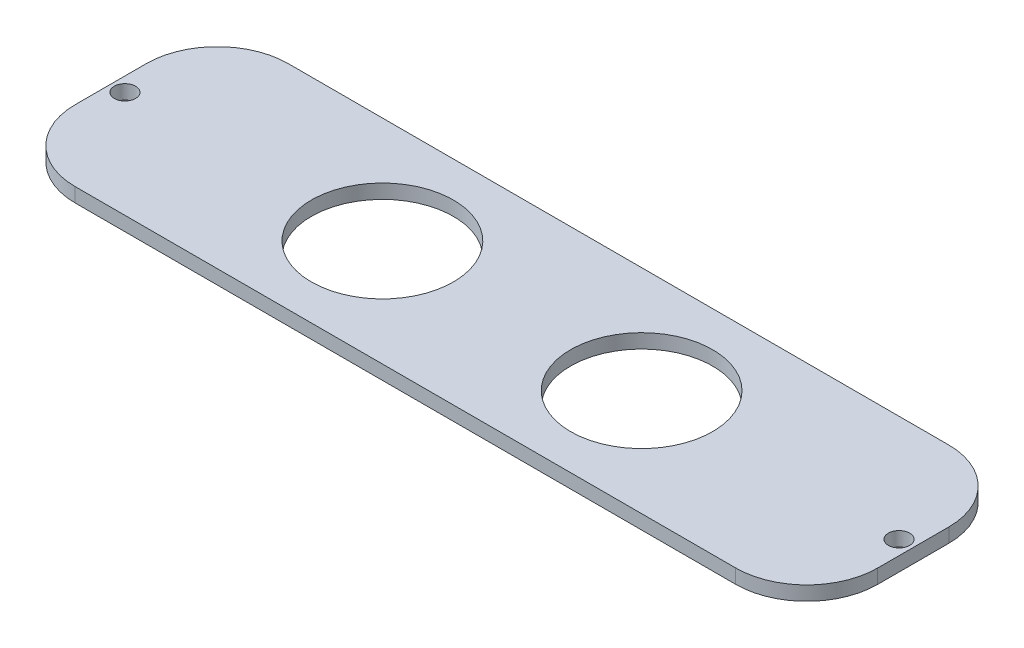
ISO-10303-21;
HEADER;
FILE_DESCRIPTION(('STEP AP214'),'2;1');
FILE_NAME('part.step','',(''),(''),'','','');
FILE_SCHEMA(('AUTOMOTIVE_DESIGN { 1 0 10303 214 1 1 1 1 }'));
ENDSEC;
DATA;
#1=APPLICATION_CONTEXT('core data for automotive mechanical design processes');
#2=APPLICATION_PROTOCOL_DEFINITION('international standard','automotive_design',2000,#1);
#3=PRODUCT_CONTEXT('',#1,'mechanical');
#4=PRODUCT('Part','Part','',(#3));
#5=PRODUCT_RELATED_PRODUCT_CATEGORY('part','',(#4));
#6=PRODUCT_DEFINITION_FORMATION('','',#4);
#7=PRODUCT_DEFINITION_CONTEXT('part definition',#1,'design');
#8=PRODUCT_DEFINITION('design','',#6,#7);
#9=PRODUCT_DEFINITION_SHAPE('','',#8);
#10=(LENGTH_UNIT() NAMED_UNIT(*) SI_UNIT(.MILLI.,.METRE.));
#11=(NAMED_UNIT(*) PLANE_ANGLE_UNIT() SI_UNIT($,.RADIAN.));
#12=(NAMED_UNIT(*) SI_UNIT($,.STERADIAN.) SOLID_ANGLE_UNIT());
#13=UNCERTAINTY_MEASURE_WITH_UNIT(LENGTH_MEASURE(1.E-05),#10,'distance_accuracy_value','');
#14=(GEOMETRIC_REPRESENTATION_CONTEXT(3) GLOBAL_UNCERTAINTY_ASSIGNED_CONTEXT((#13)) GLOBAL_UNIT_ASSIGNED_CONTEXT((#10,
#11,#12)) REPRESENTATION_CONTEXT('',''));
#15=CARTESIAN_POINT('',(0.,0.,0.));
#16=DIRECTION('',(0.,0.,1.));
#17=DIRECTION('',(1.,0.,0.));
#18=AXIS2_PLACEMENT_3D('',#15,#16,#17);
#19=CARTESIAN_POINT('',(-46.5,2.,5.));
#20=DIRECTION('',(0.,-1.,0.));
#21=DIRECTION('',(0.,0.,-1.));
#22=AXIS2_PLACEMENT_3D('',#19,#20,#21);
#23=PLANE('',#22);
#24=CARTESIAN_POINT('',(-46.5,2.,5.));
#25=DIRECTION('',(0.,1.,0.));
#26=DIRECTION('',(0.,0.,-1.));
#27=AXIS2_PLACEMENT_3D('',#24,#25,#26);
#28=CIRCLE('',#27,10.);
#29=CARTESIAN_POINT('',(-56.5,2.,4.99999999999993));
#30=VERTEX_POINT('',#29);
#31=CARTESIAN_POINT('',(-46.4999999999999,2.,15.));
#32=VERTEX_POINT('',#31);
#33=EDGE_CURVE('E148',#30,#32,#28,.T.);
#34=ORIENTED_EDGE('',*,*,#33,.T.);
#35=DIRECTION('',(1.,0.,0.));
#36=VECTOR('',#35,1.);
#37=CARTESIAN_POINT('',(-46.4999999999999,2.,15.));
#38=LINE('',#37,#36);
#39=CARTESIAN_POINT('',(46.4999999999999,2.,15.));
#40=VERTEX_POINT('',#39);
#41=EDGE_CURVE('E96',#32,#40,#38,.T.);
#42=ORIENTED_EDGE('',*,*,#41,.T.);
#43=CARTESIAN_POINT('',(46.5,2.,5.));
#44=DIRECTION('',(0.,1.,0.));
#45=DIRECTION('',(0.,0.,1.));
#46=AXIS2_PLACEMENT_3D('',#43,#44,#45);
#47=CIRCLE('',#46,10.);
#48=CARTESIAN_POINT('',(56.5,2.,4.99999999999993));
#49=VERTEX_POINT('',#48);
#50=EDGE_CURVE('E163',#40,#49,#47,.T.);
#51=ORIENTED_EDGE('',*,*,#50,.T.);
#52=DIRECTION('',(0.,0.,-1.));
#53=VECTOR('',#52,1.);
#54=CARTESIAN_POINT('',(56.5,2.,4.99999999999993));
#55=LINE('',#54,#53);
#56=CARTESIAN_POINT('',(56.5,2.,-4.99999999999993));
#57=VERTEX_POINT('',#56);
#58=EDGE_CURVE('E176',#49,#57,#55,.T.);
#59=ORIENTED_EDGE('',*,*,#58,.T.);
#60=CARTESIAN_POINT('',(46.5,2.,-5.));
#61=DIRECTION('',(0.,1.,0.));
#62=DIRECTION('',(0.,0.,-1.));
#63=AXIS2_PLACEMENT_3D('',#60,#61,#62);
#64=CIRCLE('',#63,10.);
#65=CARTESIAN_POINT('',(46.4999999999999,2.,-15.));
#66=VERTEX_POINT('',#65);
#67=EDGE_CURVE('E115',#57,#66,#64,.T.);
#68=ORIENTED_EDGE('',*,*,#67,.T.);
#69=DIRECTION('',(-1.,0.,0.));
#70=VECTOR('',#69,1.);
#71=CARTESIAN_POINT('',(-46.4999999999999,2.,-15.));
#72=LINE('',#71,#70);
#73=CARTESIAN_POINT('',(-46.4999999999999,2.,-15.));
#74=VERTEX_POINT('',#73);
#75=EDGE_CURVE('E109',#66,#74,#72,.T.);
#76=ORIENTED_EDGE('',*,*,#75,.T.);
#77=CARTESIAN_POINT('',(-46.5,2.,-5.));
#78=DIRECTION('',(0.,1.,0.));
#79=DIRECTION('',(0.,0.,-1.));
#80=AXIS2_PLACEMENT_3D('',#77,#78,#79);
#81=CIRCLE('',#80,10.);
#82=CARTESIAN_POINT('',(-56.5,2.,-4.99999999999993));
#83=VERTEX_POINT('',#82);
#84=EDGE_CURVE('E113',#74,#83,#81,.T.);
#85=ORIENTED_EDGE('',*,*,#84,.T.);
#86=DIRECTION('',(0.,0.,1.));
#87=VECTOR('',#86,1.);
#88=CARTESIAN_POINT('',(-56.5,2.,4.99999999999993));
#89=LINE('',#88,#87);
#90=EDGE_CURVE('E53',#83,#30,#89,.T.);
#91=ORIENTED_EDGE('',*,*,#90,.T.);
#92=EDGE_LOOP('',(#34,#42,#51,#59,#68,#76,#85,#91));
#93=FACE_BOUND('',#92,.T.);
#94=CARTESIAN_POINT('',(18.25,2.,0.));
#95=DIRECTION('',(0.,1.,0.));
#96=DIRECTION('',(0.,0.,1.));
#97=AXIS2_PLACEMENT_3D('',#94,#95,#96);
#98=CIRCLE('',#97,10.);
#99=CARTESIAN_POINT('',(18.25,2.,9.99999999999999));
#100=VERTEX_POINT('',#99);
#101=EDGE_CURVE('E137',#100,#100,#98,.T.);
#102=ORIENTED_EDGE('',*,*,#101,.F.);
#103=EDGE_LOOP('',(#102));
#104=FACE_BOUND('',#103,.T.);
#105=CARTESIAN_POINT('',(-18.25,2.,0.));
#106=DIRECTION('',(0.,1.,0.));
#107=DIRECTION('',(0.,0.,1.));
#108=AXIS2_PLACEMENT_3D('',#105,#106,#107);
#109=CIRCLE('',#108,10.);
#110=CARTESIAN_POINT('',(-18.25,2.,10.));
#111=VERTEX_POINT('',#110);
#112=EDGE_CURVE('E185',#111,#111,#109,.T.);
#113=ORIENTED_EDGE('',*,*,#112,.F.);
#114=EDGE_LOOP('',(#113));
#115=FACE_BOUND('',#114,.T.);
#116=CARTESIAN_POINT('',(54.5,2.,0.));
#117=DIRECTION('',(0.,1.,0.));
#118=DIRECTION('',(0.,0.,1.));
#119=AXIS2_PLACEMENT_3D('',#116,#117,#118);
#120=CIRCLE('',#119,1.5);
#121=CARTESIAN_POINT('',(54.5,2.,1.5));
#122=VERTEX_POINT('',#121);
#123=EDGE_CURVE('E191',#122,#122,#120,.T.);
#124=ORIENTED_EDGE('',*,*,#123,.F.);
#125=EDGE_LOOP('',(#124));
#126=FACE_BOUND('',#125,.T.);
#127=CARTESIAN_POINT('',(-54.5,2.,0.));
#128=DIRECTION('',(0.,1.,0.));
#129=DIRECTION('',(0.,0.,1.));
#130=AXIS2_PLACEMENT_3D('',#127,#128,#129);
#131=CIRCLE('',#130,1.5);
#132=CARTESIAN_POINT('',(-54.5,2.,1.5));
#133=VERTEX_POINT('',#132);
#134=EDGE_CURVE('E197',#133,#133,#131,.T.);
#135=ORIENTED_EDGE('',*,*,#134,.F.);
#136=EDGE_LOOP('',(#135));
#137=FACE_BOUND('',#136,.T.);
#138=ADVANCED_FACE('F36',(#93,#104,#115,#126,#137),#23,.F.);
#139=CARTESIAN_POINT('',(-46.5,0.,5.));
#140=DIRECTION('',(0.,-1.,0.));
#141=DIRECTION('',(0.,0.,-1.));
#142=AXIS2_PLACEMENT_3D('',#139,#140,#141);
#143=PLANE('',#142);
#144=CARTESIAN_POINT('',(54.5,0.,0.));
#145=DIRECTION('',(0.,1.,0.));
#146=DIRECTION('',(0.,0.,1.));
#147=AXIS2_PLACEMENT_3D('',#144,#145,#146);
#148=CIRCLE('',#147,1.5);
#149=CARTESIAN_POINT('',(54.5,0.,1.5));
#150=VERTEX_POINT('',#149);
#151=EDGE_CURVE('E194',#150,#150,#148,.T.);
#152=ORIENTED_EDGE('',*,*,#151,.T.);
#153=EDGE_LOOP('',(#152));
#154=FACE_BOUND('',#153,.T.);
#155=CARTESIAN_POINT('',(18.25,0.,0.));
#156=DIRECTION('',(0.,1.,0.));
#157=DIRECTION('',(0.,0.,1.));
#158=AXIS2_PLACEMENT_3D('',#155,#156,#157);
#159=CIRCLE('',#158,10.);
#160=CARTESIAN_POINT('',(18.25,0.,9.99999999999999));
#161=VERTEX_POINT('',#160);
#162=EDGE_CURVE('E182',#161,#161,#159,.T.);
#163=ORIENTED_EDGE('',*,*,#162,.T.);
#164=EDGE_LOOP('',(#163));
#165=FACE_BOUND('',#164,.T.);
#166=CARTESIAN_POINT('',(-46.5,0.,5.));
#167=DIRECTION('',(0.,1.,0.));
#168=DIRECTION('',(0.,0.,-1.));
#169=AXIS2_PLACEMENT_3D('',#166,#167,#168);
#170=CIRCLE('',#169,10.);
#171=CARTESIAN_POINT('',(-56.5,0.,4.99999999999993));
#172=VERTEX_POINT('',#171);
#173=CARTESIAN_POINT('',(-46.4999999999999,0.,15.));
#174=VERTEX_POINT('',#173);
#175=EDGE_CURVE('E133',#172,#174,#170,.T.);
#176=ORIENTED_EDGE('',*,*,#175,.F.);
#177=DIRECTION('',(0.,0.,1.));
#178=VECTOR('',#177,1.);
#179=CARTESIAN_POINT('',(-56.5,0.,4.99999999999993));
#180=LINE('',#179,#178);
#181=CARTESIAN_POINT('',(-56.5,0.,-4.99999999999993));
#182=VERTEX_POINT('',#181);
#183=EDGE_CURVE('E88',#182,#172,#180,.T.);
#184=ORIENTED_EDGE('',*,*,#183,.F.);
#185=CARTESIAN_POINT('',(-46.5,0.,-5.));
#186=DIRECTION('',(0.,1.,0.));
#187=DIRECTION('',(0.,0.,-1.));
#188=AXIS2_PLACEMENT_3D('',#185,#186,#187);
#189=CIRCLE('',#188,10.);
#190=CARTESIAN_POINT('',(-46.4999999999999,0.,-15.));
#191=VERTEX_POINT('',#190);
#192=EDGE_CURVE('E82',#191,#182,#189,.T.);
#193=ORIENTED_EDGE('',*,*,#192,.F.);
#194=DIRECTION('',(-1.,0.,0.));
#195=VECTOR('',#194,1.);
#196=CARTESIAN_POINT('',(-46.4999999999999,0.,-15.));
#197=LINE('',#196,#195);
#198=CARTESIAN_POINT('',(46.4999999999999,0.,-15.));
#199=VERTEX_POINT('',#198);
#200=EDGE_CURVE('E123',#199,#191,#197,.T.);
#201=ORIENTED_EDGE('',*,*,#200,.F.);
#202=CARTESIAN_POINT('',(46.5,0.,-5.));
#203=DIRECTION('',(0.,1.,0.));
#204=DIRECTION('',(0.,0.,-1.));
#205=AXIS2_PLACEMENT_3D('',#202,#203,#204);
#206=CIRCLE('',#205,10.);
#207=CARTESIAN_POINT('',(56.5,0.,-4.99999999999993));
#208=VERTEX_POINT('',#207);
#209=EDGE_CURVE('E143',#208,#199,#206,.T.);
#210=ORIENTED_EDGE('',*,*,#209,.F.);
#211=DIRECTION('',(0.,0.,-1.));
#212=VECTOR('',#211,1.);
#213=CARTESIAN_POINT('',(56.5,0.,4.99999999999993));
#214=LINE('',#213,#212);
#215=CARTESIAN_POINT('',(56.5,0.,4.99999999999993));
#216=VERTEX_POINT('',#215);
#217=EDGE_CURVE('E141',#216,#208,#214,.T.);
#218=ORIENTED_EDGE('',*,*,#217,.F.);
#219=CARTESIAN_POINT('',(46.5,0.,5.));
#220=DIRECTION('',(0.,1.,0.));
#221=DIRECTION('',(0.,0.,1.));
#222=AXIS2_PLACEMENT_3D('',#219,#220,#221);
#223=CIRCLE('',#222,10.);
#224=CARTESIAN_POINT('',(46.4999999999999,0.,15.));
#225=VERTEX_POINT('',#224);
#226=EDGE_CURVE('E139',#225,#216,#223,.T.);
#227=ORIENTED_EDGE('',*,*,#226,.F.);
#228=DIRECTION('',(1.,0.,0.));
#229=VECTOR('',#228,1.);
#230=CARTESIAN_POINT('',(-46.4999999999999,0.,15.));
#231=LINE('',#230,#229);
#232=EDGE_CURVE('E136',#174,#225,#231,.T.);
#233=ORIENTED_EDGE('',*,*,#232,.F.);
#234=EDGE_LOOP('',(#176,#184,#193,#201,#210,#218,#227,#233));
#235=FACE_BOUND('',#234,.T.);
#236=CARTESIAN_POINT('',(-18.25,0.,0.));
#237=DIRECTION('',(0.,1.,0.));
#238=DIRECTION('',(0.,0.,1.));
#239=AXIS2_PLACEMENT_3D('',#236,#237,#238);
#240=CIRCLE('',#239,10.);
#241=CARTESIAN_POINT('',(-18.25,0.,10.));
#242=VERTEX_POINT('',#241);
#243=EDGE_CURVE('E188',#242,#242,#240,.T.);
#244=ORIENTED_EDGE('',*,*,#243,.T.);
#245=EDGE_LOOP('',(#244));
#246=FACE_BOUND('',#245,.T.);
#247=CARTESIAN_POINT('',(-54.5,0.,0.));
#248=DIRECTION('',(0.,1.,0.));
#249=DIRECTION('',(0.,0.,1.));
#250=AXIS2_PLACEMENT_3D('',#247,#248,#249);
#251=CIRCLE('',#250,1.5);
#252=CARTESIAN_POINT('',(-54.5,0.,1.5));
#253=VERTEX_POINT('',#252);
#254=EDGE_CURVE('E200',#253,#253,#251,.T.);
#255=ORIENTED_EDGE('',*,*,#254,.T.);
#256=EDGE_LOOP('',(#255));
#257=FACE_BOUND('',#256,.T.);
#258=ADVANCED_FACE('F167',(#154,#165,#235,#246,#257),#143,.T.);
#259=CARTESIAN_POINT('',(-46.5,2.,5.));
#260=DIRECTION('',(0.,-1.,0.));
#261=DIRECTION('',(0.,0.,-1.));
#262=AXIS2_PLACEMENT_3D('',#259,#260,#261);
#263=CYLINDRICAL_SURFACE('',#262,10.);
#264=ORIENTED_EDGE('',*,*,#175,.T.);
#265=DIRECTION('',(0.,-1.,0.));
#266=VECTOR('',#265,1.);
#267=CARTESIAN_POINT('',(-46.4999999999999,2.,15.));
#268=LINE('',#267,#266);
#269=EDGE_CURVE('E11',#32,#174,#268,.T.);
#270=ORIENTED_EDGE('',*,*,#269,.F.);
#271=ORIENTED_EDGE('',*,*,#33,.F.);
#272=DIRECTION('',(0.,-1.,0.));
#273=VECTOR('',#272,1.);
#274=CARTESIAN_POINT('',(-56.5,2.,4.99999999999993));
#275=LINE('',#274,#273);
#276=EDGE_CURVE('E129',#30,#172,#275,.T.);
#277=ORIENTED_EDGE('',*,*,#276,.T.);
#278=EDGE_LOOP('',(#264,#270,#271,#277));
#279=FACE_BOUND('',#278,.T.);
#280=ADVANCED_FACE('F38',(#279),#263,.T.);
#281=CARTESIAN_POINT('',(-46.4999999999999,2.,15.));
#282=DIRECTION('',(0.,0.,-1.));
#283=DIRECTION('',(-1.,0.,0.));
#284=AXIS2_PLACEMENT_3D('',#281,#282,#283);
#285=PLANE('',#284);
#286=ORIENTED_EDGE('',*,*,#232,.T.);
#287=DIRECTION('',(0.,-1.,0.));
#288=VECTOR('',#287,1.);
#289=CARTESIAN_POINT('',(46.4999999999999,2.,15.));
#290=LINE('',#289,#288);
#291=EDGE_CURVE('E45',#40,#225,#290,.T.);
#292=ORIENTED_EDGE('',*,*,#291,.F.);
#293=ORIENTED_EDGE('',*,*,#41,.F.);
#294=ORIENTED_EDGE('',*,*,#269,.T.);
#295=EDGE_LOOP('',(#286,#292,#293,#294));
#296=FACE_BOUND('',#295,.T.);
#297=ADVANCED_FACE('F232',(#296),#285,.F.);
#298=CARTESIAN_POINT('',(46.5,2.,5.));
#299=DIRECTION('',(0.,-1.,0.));
#300=DIRECTION('',(0.,0.,-1.));
#301=AXIS2_PLACEMENT_3D('',#298,#299,#300);
#302=CYLINDRICAL_SURFACE('',#301,10.);
#303=ORIENTED_EDGE('',*,*,#226,.T.);
#304=DIRECTION('',(0.,-1.,0.));
#305=VECTOR('',#304,1.);
#306=CARTESIAN_POINT('',(56.5,2.,4.99999999999993));
#307=LINE('',#306,#305);
#308=EDGE_CURVE('E155',#49,#216,#307,.T.);
#309=ORIENTED_EDGE('',*,*,#308,.F.);
#310=ORIENTED_EDGE('',*,*,#50,.F.);
#311=ORIENTED_EDGE('',*,*,#291,.T.);
#312=EDGE_LOOP('',(#303,#309,#310,#311));
#313=FACE_BOUND('',#312,.T.);
#314=ADVANCED_FACE('F161',(#313),#302,.T.);
#315=CARTESIAN_POINT('',(56.5,2.,4.99999999999993));
#316=DIRECTION('',(-1.,0.,0.));
#317=DIRECTION('',(0.,0.,1.));
#318=AXIS2_PLACEMENT_3D('',#315,#316,#317);
#319=PLANE('',#318);
#320=ORIENTED_EDGE('',*,*,#217,.T.);
#321=DIRECTION('',(0.,-1.,0.));
#322=VECTOR('',#321,1.);
#323=CARTESIAN_POINT('',(56.5,2.,-4.99999999999993));
#324=LINE('',#323,#322);
#325=EDGE_CURVE('E152',#57,#208,#324,.T.);
#326=ORIENTED_EDGE('',*,*,#325,.F.);
#327=ORIENTED_EDGE('',*,*,#58,.F.);
#328=ORIENTED_EDGE('',*,*,#308,.T.);
#329=EDGE_LOOP('',(#320,#326,#327,#328));
#330=FACE_BOUND('',#329,.T.);
#331=ADVANCED_FACE('F172',(#330),#319,.F.);
#332=CARTESIAN_POINT('',(46.5,2.,-5.));
#333=DIRECTION('',(0.,-1.,0.));
#334=DIRECTION('',(0.,0.,-1.));
#335=AXIS2_PLACEMENT_3D('',#332,#333,#334);
#336=CYLINDRICAL_SURFACE('',#335,10.);
#337=ORIENTED_EDGE('',*,*,#209,.T.);
#338=DIRECTION('',(0.,-1.,0.));
#339=VECTOR('',#338,1.);
#340=CARTESIAN_POINT('',(46.4999999999999,2.,-15.));
#341=LINE('',#340,#339);
#342=EDGE_CURVE('E124',#66,#199,#341,.T.);
#343=ORIENTED_EDGE('',*,*,#342,.F.);
#344=ORIENTED_EDGE('',*,*,#67,.F.);
#345=ORIENTED_EDGE('',*,*,#325,.T.);
#346=EDGE_LOOP('',(#337,#343,#344,#345));
#347=FACE_BOUND('',#346,.T.);
#348=ADVANCED_FACE('F175',(#347),#336,.T.);
#349=CARTESIAN_POINT('',(-46.4999999999999,2.,-15.));
#350=DIRECTION('',(0.,0.,1.));
#351=DIRECTION('',(1.,0.,0.));
#352=AXIS2_PLACEMENT_3D('',#349,#350,#351);
#353=PLANE('',#352);
#354=ORIENTED_EDGE('',*,*,#200,.T.);
#355=DIRECTION('',(0.,-1.,0.));
#356=VECTOR('',#355,1.);
#357=CARTESIAN_POINT('',(-46.4999999999999,2.,-15.));
#358=LINE('',#357,#356);
#359=EDGE_CURVE('E120',#74,#191,#358,.T.);
#360=ORIENTED_EDGE('',*,*,#359,.F.);
#361=ORIENTED_EDGE('',*,*,#75,.F.);
#362=ORIENTED_EDGE('',*,*,#342,.T.);
#363=EDGE_LOOP('',(#354,#360,#361,#362));
#364=FACE_BOUND('',#363,.T.);
#365=ADVANCED_FACE('F121',(#364),#353,.F.);
#366=CARTESIAN_POINT('',(-46.5,2.,-5.));
#367=DIRECTION('',(0.,-1.,0.));
#368=DIRECTION('',(0.,0.,-1.));
#369=AXIS2_PLACEMENT_3D('',#366,#367,#368);
#370=CYLINDRICAL_SURFACE('',#369,10.);
#371=ORIENTED_EDGE('',*,*,#192,.T.);
#372=DIRECTION('',(0.,-1.,0.));
#373=VECTOR('',#372,1.);
#374=CARTESIAN_POINT('',(-56.5,2.,-4.99999999999993));
#375=LINE('',#374,#373);
#376=EDGE_CURVE('E125',#83,#182,#375,.T.);
#377=ORIENTED_EDGE('',*,*,#376,.F.);
#378=ORIENTED_EDGE('',*,*,#84,.F.);
#379=ORIENTED_EDGE('',*,*,#359,.T.);
#380=EDGE_LOOP('',(#371,#377,#378,#379));
#381=FACE_BOUND('',#380,.T.);
#382=ADVANCED_FACE('F127',(#381),#370,.T.);
#383=CARTESIAN_POINT('',(-56.5,2.,4.99999999999993));
#384=DIRECTION('',(1.,0.,0.));
#385=DIRECTION('',(0.,0.,-1.));
#386=AXIS2_PLACEMENT_3D('',#383,#384,#385);
#387=PLANE('',#386);
#388=ORIENTED_EDGE('',*,*,#183,.T.);
#389=ORIENTED_EDGE('',*,*,#276,.F.);
#390=ORIENTED_EDGE('',*,*,#90,.F.);
#391=ORIENTED_EDGE('',*,*,#376,.T.);
#392=EDGE_LOOP('',(#388,#389,#390,#391));
#393=FACE_BOUND('',#392,.T.);
#394=ADVANCED_FACE('F220',(#393),#387,.F.);
#395=CARTESIAN_POINT('',(18.25,2.,0.));
#396=DIRECTION('',(0.,-1.,0.));
#397=DIRECTION('',(0.,0.,-1.));
#398=AXIS2_PLACEMENT_3D('',#395,#396,#397);
#399=CYLINDRICAL_SURFACE('',#398,10.);
#400=ORIENTED_EDGE('',*,*,#101,.T.);
#401=EDGE_LOOP('',(#400));
#402=FACE_BOUND('',#401,.T.);
#403=ORIENTED_EDGE('',*,*,#162,.F.);
#404=EDGE_LOOP('',(#403));
#405=FACE_BOUND('',#404,.T.);
#406=ADVANCED_FACE('F217',(#402,#405),#399,.F.);
#407=CARTESIAN_POINT('',(-18.25,2.,0.));
#408=DIRECTION('',(0.,-1.,0.));
#409=DIRECTION('',(0.,0.,-1.));
#410=AXIS2_PLACEMENT_3D('',#407,#408,#409);
#411=CYLINDRICAL_SURFACE('',#410,10.);
#412=ORIENTED_EDGE('',*,*,#112,.T.);
#413=EDGE_LOOP('',(#412));
#414=FACE_BOUND('',#413,.T.);
#415=ORIENTED_EDGE('',*,*,#243,.F.);
#416=EDGE_LOOP('',(#415));
#417=FACE_BOUND('',#416,.T.);
#418=ADVANCED_FACE('F296',(#414,#417),#411,.F.);
#419=CARTESIAN_POINT('',(54.5,2.,0.));
#420=DIRECTION('',(0.,-1.,0.));
#421=DIRECTION('',(0.,0.,-1.));
#422=AXIS2_PLACEMENT_3D('',#419,#420,#421);
#423=CYLINDRICAL_SURFACE('',#422,1.5);
#424=ORIENTED_EDGE('',*,*,#123,.T.);
#425=EDGE_LOOP('',(#424));
#426=FACE_BOUND('',#425,.T.);
#427=ORIENTED_EDGE('',*,*,#151,.F.);
#428=EDGE_LOOP('',(#427));
#429=FACE_BOUND('',#428,.T.);
#430=ADVANCED_FACE('F304',(#426,#429),#423,.F.);
#431=CARTESIAN_POINT('',(-54.5,2.,0.));
#432=DIRECTION('',(0.,-1.,0.));
#433=DIRECTION('',(0.,0.,-1.));
#434=AXIS2_PLACEMENT_3D('',#431,#432,#433);
#435=CYLINDRICAL_SURFACE('',#434,1.5);
#436=ORIENTED_EDGE('',*,*,#134,.T.);
#437=EDGE_LOOP('',(#436));
#438=FACE_BOUND('',#437,.T.);
#439=ORIENTED_EDGE('',*,*,#254,.F.);
#440=EDGE_LOOP('',(#439));
#441=FACE_BOUND('',#440,.T.);
#442=ADVANCED_FACE('F206',(#438,#441),#435,.F.);
#443=CLOSED_SHELL('',(#138,#258,#280,#297,#314,#331,#348,#365,#382,#394,#406,#418,#430,#442));
#444=MANIFOLD_SOLID_BREP('B2',#443);
#445=ADVANCED_BREP_SHAPE_REPRESENTATION('',(#18,#444),#14);
#446=SHAPE_DEFINITION_REPRESENTATION(#9,#445);
ENDSEC;
END-ISO-10303-21;
